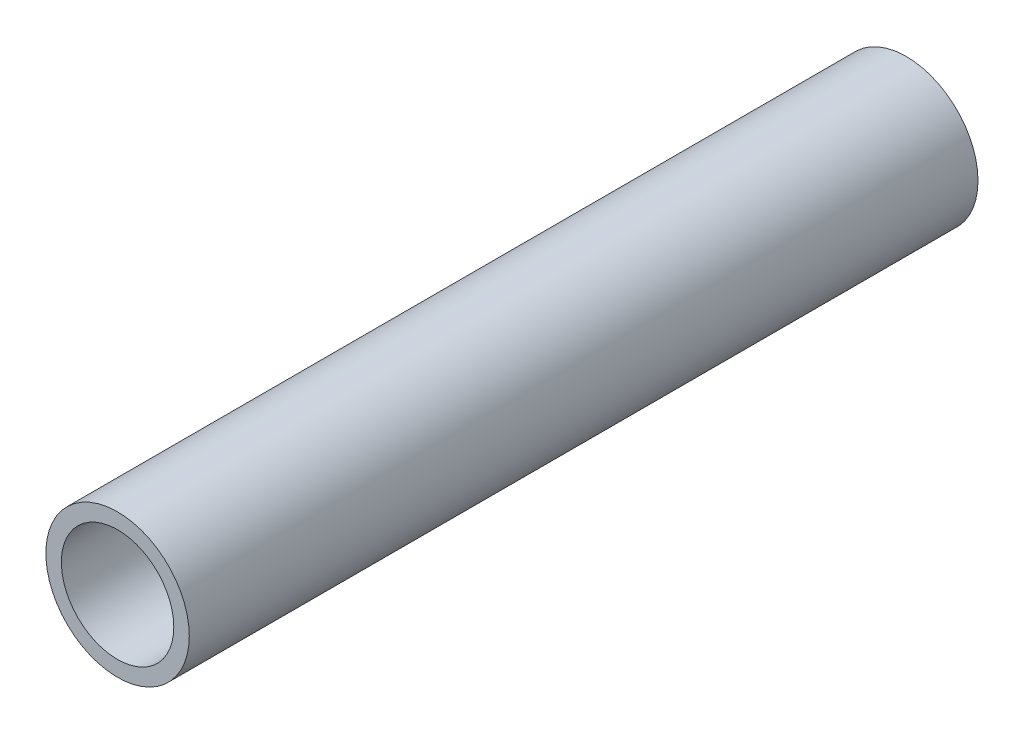
ISO-10303-21;
HEADER;
FILE_DESCRIPTION(('STEP AP214'),'2;1');
FILE_NAME('part.step','',(''),(''),'','','');
FILE_SCHEMA(('AUTOMOTIVE_DESIGN { 1 0 10303 214 1 1 1 1 }'));
ENDSEC;
DATA;
#1=APPLICATION_CONTEXT('core data for automotive mechanical design processes');
#2=APPLICATION_PROTOCOL_DEFINITION('international standard','automotive_design',2000,#1);
#3=PRODUCT_CONTEXT('',#1,'mechanical');
#4=PRODUCT('Part','Part','',(#3));
#5=PRODUCT_RELATED_PRODUCT_CATEGORY('part','',(#4));
#6=PRODUCT_DEFINITION_FORMATION('','',#4);
#7=PRODUCT_DEFINITION_CONTEXT('part definition',#1,'design');
#8=PRODUCT_DEFINITION('design','',#6,#7);
#9=PRODUCT_DEFINITION_SHAPE('','',#8);
#10=(LENGTH_UNIT() NAMED_UNIT(*) SI_UNIT(.MILLI.,.METRE.));
#11=(NAMED_UNIT(*) PLANE_ANGLE_UNIT() SI_UNIT($,.RADIAN.));
#12=(NAMED_UNIT(*) SI_UNIT($,.STERADIAN.) SOLID_ANGLE_UNIT());
#13=UNCERTAINTY_MEASURE_WITH_UNIT(LENGTH_MEASURE(1.E-05),#10,'distance_accuracy_value','');
#14=(GEOMETRIC_REPRESENTATION_CONTEXT(3) GLOBAL_UNCERTAINTY_ASSIGNED_CONTEXT((#13)) GLOBAL_UNIT_ASSIGNED_CONTEXT((#10,
#11,#12)) REPRESENTATION_CONTEXT('',''));
#15=CARTESIAN_POINT('',(0.,0.,0.));
#16=DIRECTION('',(0.,0.,1.));
#17=DIRECTION('',(1.,0.,0.));
#18=AXIS2_PLACEMENT_3D('',#15,#16,#17);
#19=CARTESIAN_POINT('',(0.,0.,34.925));
#20=DIRECTION('',(0.,0.,1.));
#21=DIRECTION('',(1.,0.,0.));
#22=AXIS2_PLACEMENT_3D('',#19,#20,#21);
#23=PLANE('',#22);
#24=CARTESIAN_POINT('',(0.,0.,34.925));
#25=DIRECTION('',(0.,0.,1.));
#26=DIRECTION('',(1.,0.,0.));
#27=AXIS2_PLACEMENT_3D('',#24,#25,#26);
#28=CIRCLE('',#27,3.175);
#29=CARTESIAN_POINT('',(3.175,0.,34.925));
#30=VERTEX_POINT('',#29);
#31=EDGE_CURVE('E10',#30,#30,#28,.T.);
#32=ORIENTED_EDGE('',*,*,#31,.T.);
#33=EDGE_LOOP('',(#32));
#34=FACE_BOUND('',#33,.T.);
#35=CARTESIAN_POINT('',(0.,0.,34.925));
#36=DIRECTION('',(0.,0.,1.));
#37=DIRECTION('',(1.,0.,0.));
#38=AXIS2_PLACEMENT_3D('',#35,#36,#37);
#39=CIRCLE('',#38,2.4892);
#40=CARTESIAN_POINT('',(2.4892,0.,34.925));
#41=VERTEX_POINT('',#40);
#42=EDGE_CURVE('E56',#41,#41,#39,.T.);
#43=ORIENTED_EDGE('',*,*,#42,.F.);
#44=EDGE_LOOP('',(#43));
#45=FACE_BOUND('',#44,.T.);
#46=ADVANCED_FACE('F43',(#34,#45),#23,.T.);
#47=CARTESIAN_POINT('',(0.,0.,0.));
#48=DIRECTION('',(0.,0.,1.));
#49=DIRECTION('',(1.,0.,0.));
#50=AXIS2_PLACEMENT_3D('',#47,#48,#49);
#51=PLANE('',#50);
#52=CARTESIAN_POINT('',(0.,0.,0.));
#53=DIRECTION('',(0.,0.,1.));
#54=DIRECTION('',(1.,0.,0.));
#55=AXIS2_PLACEMENT_3D('',#52,#53,#54);
#56=CIRCLE('',#55,3.175);
#57=CARTESIAN_POINT('',(3.175,0.,0.));
#58=VERTEX_POINT('',#57);
#59=EDGE_CURVE('E47',#58,#58,#56,.T.);
#60=ORIENTED_EDGE('',*,*,#59,.F.);
#61=EDGE_LOOP('',(#60));
#62=FACE_BOUND('',#61,.T.);
#63=CARTESIAN_POINT('',(0.,0.,0.));
#64=DIRECTION('',(0.,0.,1.));
#65=DIRECTION('',(1.,0.,0.));
#66=AXIS2_PLACEMENT_3D('',#63,#64,#65);
#67=CIRCLE('',#66,2.4892);
#68=CARTESIAN_POINT('',(2.4892,0.,0.));
#69=VERTEX_POINT('',#68);
#70=EDGE_CURVE('E58',#69,#69,#67,.T.);
#71=ORIENTED_EDGE('',*,*,#70,.T.);
#72=EDGE_LOOP('',(#71));
#73=FACE_BOUND('',#72,.T.);
#74=ADVANCED_FACE('F70',(#62,#73),#51,.F.);
#75=CARTESIAN_POINT('',(0.,0.,34.925));
#76=DIRECTION('',(0.,0.,-1.));
#77=DIRECTION('',(-1.,0.,0.));
#78=AXIS2_PLACEMENT_3D('',#75,#76,#77);
#79=CYLINDRICAL_SURFACE('',#78,3.175);
#80=ORIENTED_EDGE('',*,*,#31,.F.);
#81=EDGE_LOOP('',(#80));
#82=FACE_BOUND('',#81,.T.);
#83=ORIENTED_EDGE('',*,*,#59,.T.);
#84=EDGE_LOOP('',(#83));
#85=FACE_BOUND('',#84,.T.);
#86=ADVANCED_FACE('F45',(#82,#85),#79,.T.);
#87=CARTESIAN_POINT('',(0.,0.,34.925));
#88=DIRECTION('',(0.,0.,-1.));
#89=DIRECTION('',(-1.,0.,0.));
#90=AXIS2_PLACEMENT_3D('',#87,#88,#89);
#91=CYLINDRICAL_SURFACE('',#90,2.4892);
#92=ORIENTED_EDGE('',*,*,#42,.T.);
#93=EDGE_LOOP('',(#92));
#94=FACE_BOUND('',#93,.T.);
#95=ORIENTED_EDGE('',*,*,#70,.F.);
#96=EDGE_LOOP('',(#95));
#97=FACE_BOUND('',#96,.T.);
#98=ADVANCED_FACE('F66',(#94,#97),#91,.F.);
#99=CLOSED_SHELL('',(#46,#74,#86,#98));
#100=MANIFOLD_SOLID_BREP('B2',#99);
#101=ADVANCED_BREP_SHAPE_REPRESENTATION('',(#18,#100),#14);
#102=SHAPE_DEFINITION_REPRESENTATION(#9,#101);
ENDSEC;
END-ISO-10303-21;
